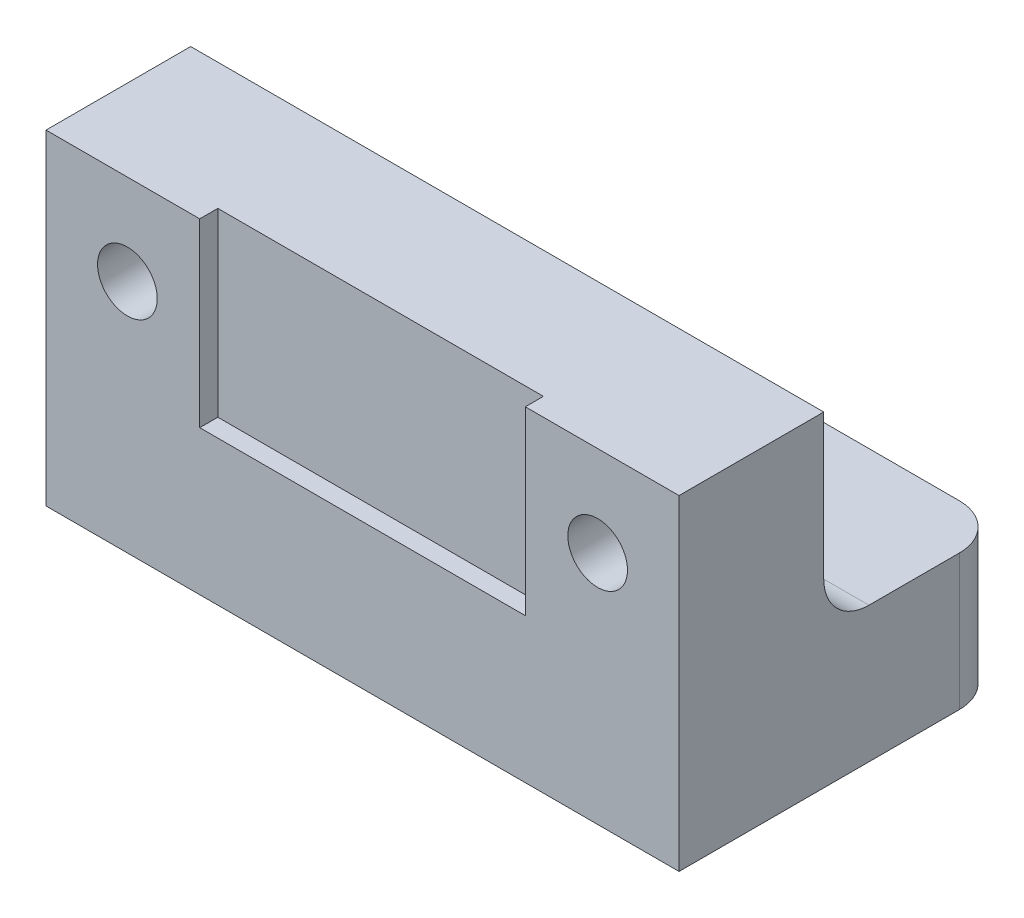
ISO-10303-21;
HEADER;
FILE_DESCRIPTION(('STEP AP214'),'2;1');
FILE_NAME('part.step','',(''),(''),'','','');
FILE_SCHEMA(('AUTOMOTIVE_DESIGN { 1 0 10303 214 1 1 1 1 }'));
ENDSEC;
DATA;
#1=APPLICATION_CONTEXT('core data for automotive mechanical design processes');
#2=APPLICATION_PROTOCOL_DEFINITION('international standard','automotive_design',2000,#1);
#3=PRODUCT_CONTEXT('',#1,'mechanical');
#4=PRODUCT('Part','Part','',(#3));
#5=PRODUCT_RELATED_PRODUCT_CATEGORY('part','',(#4));
#6=PRODUCT_DEFINITION_FORMATION('','',#4);
#7=PRODUCT_DEFINITION_CONTEXT('part definition',#1,'design');
#8=PRODUCT_DEFINITION('design','',#6,#7);
#9=PRODUCT_DEFINITION_SHAPE('','',#8);
#10=(LENGTH_UNIT() NAMED_UNIT(*) SI_UNIT(.MILLI.,.METRE.));
#11=(NAMED_UNIT(*) PLANE_ANGLE_UNIT() SI_UNIT($,.RADIAN.));
#12=(NAMED_UNIT(*) SI_UNIT($,.STERADIAN.) SOLID_ANGLE_UNIT());
#13=UNCERTAINTY_MEASURE_WITH_UNIT(LENGTH_MEASURE(1.E-05),#10,'distance_accuracy_value','');
#14=(GEOMETRIC_REPRESENTATION_CONTEXT(3) GLOBAL_UNCERTAINTY_ASSIGNED_CONTEXT((#13)) GLOBAL_UNIT_ASSIGNED_CONTEXT((#10,
#11,#12)) REPRESENTATION_CONTEXT('',''));
#15=CARTESIAN_POINT('',(0.,0.,0.));
#16=DIRECTION('',(0.,0.,1.));
#17=DIRECTION('',(1.,0.,0.));
#18=AXIS2_PLACEMENT_3D('',#15,#16,#17);
#19=CARTESIAN_POINT('',(0.,0.,0.));
#20=DIRECTION('',(0.,0.,-1.));
#21=DIRECTION('',(-1.,0.,0.));
#22=AXIS2_PLACEMENT_3D('',#19,#20,#21);
#23=PLANE('',#22);
#24=DIRECTION('',(0.,1.,0.));
#25=VECTOR('',#24,1.);
#26=CARTESIAN_POINT('',(17.5,-9.,0.));
#27=LINE('',#26,#25);
#28=CARTESIAN_POINT('',(17.5,0.999999999999997,0.));
#29=VERTEX_POINT('',#28);
#30=CARTESIAN_POINT('',(17.5,9.,0.));
#31=VERTEX_POINT('',#30);
#32=EDGE_CURVE('E179',#29,#31,#27,.T.);
#33=ORIENTED_EDGE('',*,*,#32,.F.);
#34=DIRECTION('',(-1.,0.,0.));
#35=VECTOR('',#34,1.);
#36=CARTESIAN_POINT('',(-17.5,0.999999999999994,0.));
#37=LINE('',#36,#35);
#38=CARTESIAN_POINT('',(13.,0.999999999999997,0.));
#39=VERTEX_POINT('',#38);
#40=EDGE_CURVE('E223',#29,#39,#37,.T.);
#41=ORIENTED_EDGE('',*,*,#40,.T.);
#42=CARTESIAN_POINT('',(13.,4.,0.));
#43=DIRECTION('',(0.,0.,-1.));
#44=DIRECTION('',(-1.,0.,0.));
#45=AXIS2_PLACEMENT_3D('',#42,#43,#44);
#46=CIRCLE('',#45,3.);
#47=EDGE_CURVE('E369',#39,#39,#46,.T.);
#48=ORIENTED_EDGE('',*,*,#47,.F.);
#49=DIRECTION('',(-1.,0.,0.));
#50=VECTOR('',#49,1.);
#51=CARTESIAN_POINT('',(-17.5,0.999999999999994,0.));
#52=LINE('',#51,#50);
#53=CARTESIAN_POINT('',(-13.,0.999999999999994,0.));
#54=VERTEX_POINT('',#53);
#55=EDGE_CURVE('E221',#39,#54,#52,.T.);
#56=ORIENTED_EDGE('',*,*,#55,.T.);
#57=CARTESIAN_POINT('',(-13.,4.,0.));
#58=DIRECTION('',(0.,0.,-1.));
#59=DIRECTION('',(-1.,0.,0.));
#60=AXIS2_PLACEMENT_3D('',#57,#58,#59);
#61=CIRCLE('',#60,3.);
#62=EDGE_CURVE('E371',#54,#54,#61,.T.);
#63=ORIENTED_EDGE('',*,*,#62,.F.);
#64=DIRECTION('',(-1.,0.,0.));
#65=VECTOR('',#64,1.);
#66=CARTESIAN_POINT('',(-17.5,0.999999999999994,0.));
#67=LINE('',#66,#65);
#68=CARTESIAN_POINT('',(-17.5,0.999999999999994,0.));
#69=VERTEX_POINT('',#68);
#70=EDGE_CURVE('E212',#54,#69,#67,.T.);
#71=ORIENTED_EDGE('',*,*,#70,.T.);
#72=DIRECTION('',(0.,-1.,0.));
#73=VECTOR('',#72,1.);
#74=CARTESIAN_POINT('',(-17.5,-9.,0.));
#75=LINE('',#74,#73);
#76=CARTESIAN_POINT('',(-17.5,9.,0.));
#77=VERTEX_POINT('',#76);
#78=EDGE_CURVE('E188',#77,#69,#75,.T.);
#79=ORIENTED_EDGE('',*,*,#78,.F.);
#80=DIRECTION('',(-1.,0.,0.));
#81=VECTOR('',#80,1.);
#82=CARTESIAN_POINT('',(-17.5,9.,0.));
#83=LINE('',#82,#81);
#84=EDGE_CURVE('E198',#31,#77,#83,.T.);
#85=ORIENTED_EDGE('',*,*,#84,.F.);
#86=EDGE_LOOP('',(#33,#41,#48,#56,#63,#71,#79,#85));
#87=FACE_BOUND('',#86,.T.);
#88=ADVANCED_FACE('F37',(#87),#23,.T.);
#89=CARTESIAN_POINT('',(-13.,4.,8.001));
#90=DIRECTION('',(0.,0.,-1.));
#91=DIRECTION('',(-1.,0.,0.));
#92=AXIS2_PLACEMENT_3D('',#89,#90,#91);
#93=CYLINDRICAL_SURFACE('',#92,1.65);
#94=CARTESIAN_POINT('',(-13.,4.,8.));
#95=DIRECTION('',(0.,0.,-1.));
#96=DIRECTION('',(-1.,0.,0.));
#97=AXIS2_PLACEMENT_3D('',#94,#95,#96);
#98=CIRCLE('',#97,1.65);
#99=CARTESIAN_POINT('',(-14.65,4.,8.));
#100=VERTEX_POINT('',#99);
#101=EDGE_CURVE('E169',#100,#100,#98,.F.);
#102=ORIENTED_EDGE('',*,*,#101,.T.);
#103=EDGE_LOOP('',(#102));
#104=FACE_BOUND('',#103,.T.);
#105=CARTESIAN_POINT('',(-13.,4.,4.));
#106=DIRECTION('',(0.,0.,-1.));
#107=DIRECTION('',(-1.,0.,0.));
#108=AXIS2_PLACEMENT_3D('',#105,#106,#107);
#109=CIRCLE('',#108,1.65);
#110=CARTESIAN_POINT('',(-14.65,4.,4.));
#111=VERTEX_POINT('',#110);
#112=EDGE_CURVE('E216',#111,#111,#109,.F.);
#113=ORIENTED_EDGE('',*,*,#112,.F.);
#114=EDGE_LOOP('',(#113));
#115=FACE_BOUND('',#114,.T.);
#116=ADVANCED_FACE('F300',(#104,#115),#93,.F.);
#117=CARTESIAN_POINT('',(13.,4.,8.001));
#118=DIRECTION('',(0.,0.,-1.));
#119=DIRECTION('',(-1.,0.,0.));
#120=AXIS2_PLACEMENT_3D('',#117,#118,#119);
#121=CYLINDRICAL_SURFACE('',#120,1.65);
#122=CARTESIAN_POINT('',(13.,4.,8.));
#123=DIRECTION('',(0.,0.,-1.));
#124=DIRECTION('',(-1.,0.,0.));
#125=AXIS2_PLACEMENT_3D('',#122,#123,#124);
#126=CIRCLE('',#125,1.65);
#127=CARTESIAN_POINT('',(11.35,4.,8.));
#128=VERTEX_POINT('',#127);
#129=EDGE_CURVE('E175',#128,#128,#126,.F.);
#130=ORIENTED_EDGE('',*,*,#129,.T.);
#131=EDGE_LOOP('',(#130));
#132=FACE_BOUND('',#131,.T.);
#133=CARTESIAN_POINT('',(13.,4.,4.));
#134=DIRECTION('',(0.,0.,-1.));
#135=DIRECTION('',(-1.,0.,0.));
#136=AXIS2_PLACEMENT_3D('',#133,#134,#135);
#137=CIRCLE('',#136,1.65);
#138=CARTESIAN_POINT('',(11.35,4.,4.));
#139=VERTEX_POINT('',#138);
#140=EDGE_CURVE('E213',#139,#139,#137,.F.);
#141=ORIENTED_EDGE('',*,*,#140,.F.);
#142=EDGE_LOOP('',(#141));
#143=FACE_BOUND('',#142,.T.);
#144=ADVANCED_FACE('F304',(#132,#143),#121,.F.);
#145=CARTESIAN_POINT('',(17.5,-9.,8.));
#146=DIRECTION('',(-1.,0.,0.));
#147=DIRECTION('',(0.,0.,1.));
#148=AXIS2_PLACEMENT_3D('',#145,#146,#147);
#149=PLANE('',#148);
#150=DIRECTION('',(0.,0.,-1.));
#151=VECTOR('',#150,1.);
#152=CARTESIAN_POINT('',(17.5,-9.,8.));
#153=LINE('',#152,#151);
#154=CARTESIAN_POINT('',(17.5,-9.,8.));
#155=VERTEX_POINT('',#154);
#156=CARTESIAN_POINT('',(17.5,-9.,-7.5));
#157=VERTEX_POINT('',#156);
#158=EDGE_CURVE('E196',#155,#157,#153,.T.);
#159=ORIENTED_EDGE('',*,*,#158,.T.);
#160=DIRECTION('',(0.,1.,0.));
#161=VECTOR('',#160,1.);
#162=CARTESIAN_POINT('',(17.5,-9.,-7.5));
#163=LINE('',#162,#161);
#164=CARTESIAN_POINT('',(17.5,-1.5,-7.5));
#165=VERTEX_POINT('',#164);
#166=EDGE_CURVE('E241',#157,#165,#163,.T.);
#167=ORIENTED_EDGE('',*,*,#166,.T.);
#168=DIRECTION('',(0.,0.,1.));
#169=VECTOR('',#168,1.);
#170=CARTESIAN_POINT('',(17.5,-1.5,-10.));
#171=LINE('',#170,#169);
#172=CARTESIAN_POINT('',(17.5,-1.5,-2.5));
#173=VERTEX_POINT('',#172);
#174=EDGE_CURVE('E261',#165,#173,#171,.T.);
#175=ORIENTED_EDGE('',*,*,#174,.T.);
#176=CARTESIAN_POINT('',(17.5,0.999999999999997,-2.5));
#177=DIRECTION('',(-1.,0.,0.));
#178=DIRECTION('',(0.,0.,1.));
#179=AXIS2_PLACEMENT_3D('',#176,#177,#178);
#180=CIRCLE('',#179,2.5);
#181=EDGE_CURVE('E11',#173,#29,#180,.T.);
#182=ORIENTED_EDGE('',*,*,#181,.T.);
#183=ORIENTED_EDGE('',*,*,#32,.T.);
#184=DIRECTION('',(0.,0.,-1.));
#185=VECTOR('',#184,1.);
#186=CARTESIAN_POINT('',(17.5,9.,8.));
#187=LINE('',#186,#185);
#188=CARTESIAN_POINT('',(17.5,9.,8.));
#189=VERTEX_POINT('',#188);
#190=EDGE_CURVE('E209',#189,#31,#187,.T.);
#191=ORIENTED_EDGE('',*,*,#190,.F.);
#192=DIRECTION('',(0.,1.,0.));
#193=VECTOR('',#192,1.);
#194=CARTESIAN_POINT('',(17.5,-9.,8.));
#195=LINE('',#194,#193);
#196=EDGE_CURVE('E184',#155,#189,#195,.T.);
#197=ORIENTED_EDGE('',*,*,#196,.F.);
#198=EDGE_LOOP('',(#159,#167,#175,#182,#183,#191,#197));
#199=FACE_BOUND('',#198,.T.);
#200=ADVANCED_FACE('F268',(#199),#149,.F.);
#201=CARTESIAN_POINT('',(-17.5,9.,8.));
#202=DIRECTION('',(0.,-1.,0.));
#203=DIRECTION('',(0.,0.,-1.));
#204=AXIS2_PLACEMENT_3D('',#201,#202,#203);
#205=PLANE('',#204);
#206=DIRECTION('',(-1.,0.,0.));
#207=VECTOR('',#206,1.);
#208=CARTESIAN_POINT('',(-17.5,9.,8.));
#209=LINE('',#208,#207);
#210=CARTESIAN_POINT('',(-9.,9.,8.));
#211=VERTEX_POINT('',#210);
#212=CARTESIAN_POINT('',(-17.5,9.,8.));
#213=VERTEX_POINT('',#212);
#214=EDGE_CURVE('E187',#211,#213,#209,.T.);
#215=ORIENTED_EDGE('',*,*,#214,.F.);
#216=DIRECTION('',(0.,0.,1.));
#217=VECTOR('',#216,1.);
#218=CARTESIAN_POINT('',(-9.,9.,7.));
#219=LINE('',#218,#217);
#220=CARTESIAN_POINT('',(-9.,9.,7.));
#221=VERTEX_POINT('',#220);
#222=EDGE_CURVE('E177',#221,#211,#219,.T.);
#223=ORIENTED_EDGE('',*,*,#222,.F.);
#224=DIRECTION('',(-1.,0.,0.));
#225=VECTOR('',#224,1.);
#226=CARTESIAN_POINT('',(-9.,9.,7.));
#227=LINE('',#226,#225);
#228=CARTESIAN_POINT('',(9.,9.,7.));
#229=VERTEX_POINT('',#228);
#230=EDGE_CURVE('E151',#229,#221,#227,.T.);
#231=ORIENTED_EDGE('',*,*,#230,.F.);
#232=DIRECTION('',(0.,0.,1.));
#233=VECTOR('',#232,1.);
#234=CARTESIAN_POINT('',(9.,9.,7.));
#235=LINE('',#234,#233);
#236=CARTESIAN_POINT('',(9.,9.,8.));
#237=VERTEX_POINT('',#236);
#238=EDGE_CURVE('E180',#229,#237,#235,.T.);
#239=ORIENTED_EDGE('',*,*,#238,.T.);
#240=EDGE_CURVE('E189',#189,#237,#209,.T.);
#241=ORIENTED_EDGE('',*,*,#240,.F.);
#242=ORIENTED_EDGE('',*,*,#190,.T.);
#243=ORIENTED_EDGE('',*,*,#84,.T.);
#244=DIRECTION('',(0.,0.,-1.));
#245=VECTOR('',#244,1.);
#246=CARTESIAN_POINT('',(-17.5,9.,8.));
#247=LINE('',#246,#245);
#248=EDGE_CURVE('E206',#213,#77,#247,.T.);
#249=ORIENTED_EDGE('',*,*,#248,.F.);
#250=EDGE_LOOP('',(#215,#223,#231,#239,#241,#242,#243,#249));
#251=FACE_BOUND('',#250,.T.);
#252=ADVANCED_FACE('F277',(#251),#205,.F.);
#253=CARTESIAN_POINT('',(-17.5,-9.,8.));
#254=DIRECTION('',(1.,0.,0.));
#255=DIRECTION('',(0.,0.,-1.));
#256=AXIS2_PLACEMENT_3D('',#253,#254,#255);
#257=PLANE('',#256);
#258=DIRECTION('',(0.,0.,1.));
#259=VECTOR('',#258,1.);
#260=CARTESIAN_POINT('',(-17.5,-1.50000000000001,-10.));
#261=LINE('',#260,#259);
#262=CARTESIAN_POINT('',(-17.5,-1.50000000000001,-7.5));
#263=VERTEX_POINT('',#262);
#264=CARTESIAN_POINT('',(-17.5,-1.50000000000001,-2.5));
#265=VERTEX_POINT('',#264);
#266=EDGE_CURVE('E248',#263,#265,#261,.T.);
#267=ORIENTED_EDGE('',*,*,#266,.F.);
#268=DIRECTION('',(0.,-1.,0.));
#269=VECTOR('',#268,1.);
#270=CARTESIAN_POINT('',(-17.5,-9.,-7.5));
#271=LINE('',#270,#269);
#272=CARTESIAN_POINT('',(-17.5,-9.,-7.5));
#273=VERTEX_POINT('',#272);
#274=EDGE_CURVE('E232',#263,#273,#271,.T.);
#275=ORIENTED_EDGE('',*,*,#274,.T.);
#276=DIRECTION('',(0.,0.,-1.));
#277=VECTOR('',#276,1.);
#278=CARTESIAN_POINT('',(-17.5,-9.,8.));
#279=LINE('',#278,#277);
#280=CARTESIAN_POINT('',(-17.5,-9.,8.));
#281=VERTEX_POINT('',#280);
#282=EDGE_CURVE('E203',#281,#273,#279,.T.);
#283=ORIENTED_EDGE('',*,*,#282,.F.);
#284=DIRECTION('',(0.,-1.,0.));
#285=VECTOR('',#284,1.);
#286=CARTESIAN_POINT('',(-17.5,-9.,8.));
#287=LINE('',#286,#285);
#288=EDGE_CURVE('E192',#213,#281,#287,.T.);
#289=ORIENTED_EDGE('',*,*,#288,.F.);
#290=ORIENTED_EDGE('',*,*,#248,.T.);
#291=ORIENTED_EDGE('',*,*,#78,.T.);
#292=CARTESIAN_POINT('',(-17.5,0.999999999999994,-2.5));
#293=DIRECTION('',(1.,0.,0.));
#294=DIRECTION('',(0.,0.,-1.));
#295=AXIS2_PLACEMENT_3D('',#292,#293,#294);
#296=CIRCLE('',#295,2.5);
#297=EDGE_CURVE('E45',#69,#265,#296,.T.);
#298=ORIENTED_EDGE('',*,*,#297,.T.);
#299=EDGE_LOOP('',(#267,#275,#283,#289,#290,#291,#298));
#300=FACE_BOUND('',#299,.T.);
#301=ADVANCED_FACE('F247',(#300),#257,.F.);
#302=CARTESIAN_POINT('',(-17.5,-9.,8.));
#303=DIRECTION('',(0.,1.,0.));
#304=DIRECTION('',(0.,0.,1.));
#305=AXIS2_PLACEMENT_3D('',#302,#303,#304);
#306=PLANE('',#305);
#307=CARTESIAN_POINT('',(0.,-9.,-1.));
#308=DIRECTION('',(0.,-1.,0.));
#309=DIRECTION('',(0.,0.,-1.));
#310=AXIS2_PLACEMENT_3D('',#307,#308,#309);
#311=CIRCLE('',#310,8.);
#312=CARTESIAN_POINT('',(0.,-9.,-9.));
#313=VERTEX_POINT('',#312);
#314=EDGE_CURVE('E358',#313,#313,#311,.T.);
#315=ORIENTED_EDGE('',*,*,#314,.F.);
#316=EDGE_LOOP('',(#315));
#317=FACE_BOUND('',#316,.T.);
#318=ORIENTED_EDGE('',*,*,#282,.T.);
#319=CARTESIAN_POINT('',(-15.,-9.,-7.5));
#320=DIRECTION('',(0.,1.,0.));
#321=DIRECTION('',(0.,0.,1.));
#322=AXIS2_PLACEMENT_3D('',#319,#320,#321);
#323=CIRCLE('',#322,2.5);
#324=CARTESIAN_POINT('',(-15.,-9.00000000000001,-10.));
#325=VERTEX_POINT('',#324);
#326=EDGE_CURVE('E236',#273,#325,#323,.F.);
#327=ORIENTED_EDGE('',*,*,#326,.T.);
#328=DIRECTION('',(1.,0.,0.));
#329=VECTOR('',#328,1.);
#330=CARTESIAN_POINT('',(17.5,-9.,-10.));
#331=LINE('',#330,#329);
#332=CARTESIAN_POINT('',(15.,-9.,-10.));
#333=VERTEX_POINT('',#332);
#334=EDGE_CURVE('E360',#325,#333,#331,.T.);
#335=ORIENTED_EDGE('',*,*,#334,.T.);
#336=CARTESIAN_POINT('',(15.,-9.,-7.5));
#337=DIRECTION('',(0.,1.,0.));
#338=DIRECTION('',(0.,0.,1.));
#339=AXIS2_PLACEMENT_3D('',#336,#337,#338);
#340=CIRCLE('',#339,2.5);
#341=EDGE_CURVE('E52',#333,#157,#340,.F.);
#342=ORIENTED_EDGE('',*,*,#341,.T.);
#343=ORIENTED_EDGE('',*,*,#158,.F.);
#344=DIRECTION('',(1.,0.,0.));
#345=VECTOR('',#344,1.);
#346=CARTESIAN_POINT('',(-17.5,-9.,8.));
#347=LINE('',#346,#345);
#348=EDGE_CURVE('E194',#281,#155,#347,.T.);
#349=ORIENTED_EDGE('',*,*,#348,.F.);
#350=EDGE_LOOP('',(#318,#327,#335,#342,#343,#349));
#351=FACE_BOUND('',#350,.T.);
#352=ADVANCED_FACE('F286',(#317,#351),#306,.F.);
#353=CARTESIAN_POINT('',(0.,0.,8.));
#354=DIRECTION('',(0.,0.,-1.));
#355=DIRECTION('',(-1.,0.,0.));
#356=AXIS2_PLACEMENT_3D('',#353,#354,#355);
#357=PLANE('',#356);
#358=ORIENTED_EDGE('',*,*,#129,.F.);
#359=EDGE_LOOP('',(#358));
#360=FACE_BOUND('',#359,.T.);
#361=ORIENTED_EDGE('',*,*,#101,.F.);
#362=EDGE_LOOP('',(#361));
#363=FACE_BOUND('',#362,.T.);
#364=DIRECTION('',(1.,0.,0.));
#365=VECTOR('',#364,1.);
#366=CARTESIAN_POINT('',(-9.,-1.,8.));
#367=LINE('',#366,#365);
#368=CARTESIAN_POINT('',(-9.,-1.,8.));
#369=VERTEX_POINT('',#368);
#370=CARTESIAN_POINT('',(9.,-1.,8.));
#371=VERTEX_POINT('',#370);
#372=EDGE_CURVE('E166',#369,#371,#367,.T.);
#373=ORIENTED_EDGE('',*,*,#372,.F.);
#374=DIRECTION('',(0.,-1.,0.));
#375=VECTOR('',#374,1.);
#376=CARTESIAN_POINT('',(-9.,9.,8.));
#377=LINE('',#376,#375);
#378=EDGE_CURVE('E146',#211,#369,#377,.T.);
#379=ORIENTED_EDGE('',*,*,#378,.F.);
#380=ORIENTED_EDGE('',*,*,#214,.T.);
#381=ORIENTED_EDGE('',*,*,#288,.T.);
#382=ORIENTED_EDGE('',*,*,#348,.T.);
#383=ORIENTED_EDGE('',*,*,#196,.T.);
#384=ORIENTED_EDGE('',*,*,#240,.T.);
#385=DIRECTION('',(0.,1.,0.));
#386=VECTOR('',#385,1.);
#387=CARTESIAN_POINT('',(9.,9.,8.));
#388=LINE('',#387,#386);
#389=EDGE_CURVE('E164',#371,#237,#388,.T.);
#390=ORIENTED_EDGE('',*,*,#389,.F.);
#391=EDGE_LOOP('',(#373,#379,#380,#381,#382,#383,#384,#390));
#392=FACE_BOUND('',#391,.T.);
#393=ADVANCED_FACE('F281',(#360,#363,#392),#357,.F.);
#394=CARTESIAN_POINT('',(-9.,9.,7.));
#395=DIRECTION('',(-1.,0.,0.));
#396=DIRECTION('',(0.,-1.,0.));
#397=AXIS2_PLACEMENT_3D('',#394,#395,#396);
#398=PLANE('',#397);
#399=ORIENTED_EDGE('',*,*,#378,.T.);
#400=DIRECTION('',(0.,0.,1.));
#401=VECTOR('',#400,1.);
#402=CARTESIAN_POINT('',(-9.,-1.,7.));
#403=LINE('',#402,#401);
#404=CARTESIAN_POINT('',(-9.,-1.,7.));
#405=VERTEX_POINT('',#404);
#406=EDGE_CURVE('E139',#405,#369,#403,.T.);
#407=ORIENTED_EDGE('',*,*,#406,.F.);
#408=DIRECTION('',(0.,-1.,0.));
#409=VECTOR('',#408,1.);
#410=CARTESIAN_POINT('',(-9.,9.,7.));
#411=LINE('',#410,#409);
#412=EDGE_CURVE('E143',#221,#405,#411,.T.);
#413=ORIENTED_EDGE('',*,*,#412,.F.);
#414=ORIENTED_EDGE('',*,*,#222,.T.);
#415=EDGE_LOOP('',(#399,#407,#413,#414));
#416=FACE_BOUND('',#415,.T.);
#417=ADVANCED_FACE('F141',(#416),#398,.F.);
#418=CARTESIAN_POINT('',(9.,9.,7.));
#419=DIRECTION('',(1.,0.,0.));
#420=DIRECTION('',(0.,1.,0.));
#421=AXIS2_PLACEMENT_3D('',#418,#419,#420);
#422=PLANE('',#421);
#423=ORIENTED_EDGE('',*,*,#389,.T.);
#424=ORIENTED_EDGE('',*,*,#238,.F.);
#425=DIRECTION('',(0.,1.,0.));
#426=VECTOR('',#425,1.);
#427=CARTESIAN_POINT('',(9.,9.,7.));
#428=LINE('',#427,#426);
#429=CARTESIAN_POINT('',(9.,-1.,7.));
#430=VERTEX_POINT('',#429);
#431=EDGE_CURVE('E159',#430,#229,#428,.T.);
#432=ORIENTED_EDGE('',*,*,#431,.F.);
#433=DIRECTION('',(0.,0.,1.));
#434=VECTOR('',#433,1.);
#435=CARTESIAN_POINT('',(9.,-1.,7.));
#436=LINE('',#435,#434);
#437=EDGE_CURVE('E150',#430,#371,#436,.T.);
#438=ORIENTED_EDGE('',*,*,#437,.T.);
#439=EDGE_LOOP('',(#423,#424,#432,#438));
#440=FACE_BOUND('',#439,.T.);
#441=ADVANCED_FACE('F310',(#440),#422,.F.);
#442=CARTESIAN_POINT('',(-9.,-1.,7.));
#443=DIRECTION('',(0.,-1.,0.));
#444=DIRECTION('',(1.,0.,0.));
#445=AXIS2_PLACEMENT_3D('',#442,#443,#444);
#446=PLANE('',#445);
#447=ORIENTED_EDGE('',*,*,#372,.T.);
#448=ORIENTED_EDGE('',*,*,#437,.F.);
#449=DIRECTION('',(1.,0.,0.));
#450=VECTOR('',#449,1.);
#451=CARTESIAN_POINT('',(-9.,-1.,7.));
#452=LINE('',#451,#450);
#453=EDGE_CURVE('E154',#405,#430,#452,.T.);
#454=ORIENTED_EDGE('',*,*,#453,.F.);
#455=ORIENTED_EDGE('',*,*,#406,.T.);
#456=EDGE_LOOP('',(#447,#448,#454,#455));
#457=FACE_BOUND('',#456,.T.);
#458=ADVANCED_FACE('F155',(#457),#446,.F.);
#459=CARTESIAN_POINT('',(0.,0.,7.));
#460=DIRECTION('',(0.,0.,1.));
#461=DIRECTION('',(1.,0.,0.));
#462=AXIS2_PLACEMENT_3D('',#459,#460,#461);
#463=PLANE('',#462);
#464=ORIENTED_EDGE('',*,*,#412,.T.);
#465=ORIENTED_EDGE('',*,*,#453,.T.);
#466=ORIENTED_EDGE('',*,*,#431,.T.);
#467=ORIENTED_EDGE('',*,*,#230,.T.);
#468=EDGE_LOOP('',(#464,#465,#466,#467));
#469=FACE_BOUND('',#468,.T.);
#470=ADVANCED_FACE('F161',(#469),#463,.T.);
#471=CARTESIAN_POINT('',(13.,4.,4.));
#472=DIRECTION('',(0.,0.,-1.));
#473=DIRECTION('',(-1.,0.,0.));
#474=AXIS2_PLACEMENT_3D('',#471,#472,#473);
#475=PLANE('',#474);
#476=CARTESIAN_POINT('',(13.,4.,4.));
#477=DIRECTION('',(0.,0.,-1.));
#478=DIRECTION('',(-1.,0.,0.));
#479=AXIS2_PLACEMENT_3D('',#476,#477,#478);
#480=CIRCLE('',#479,3.);
#481=CARTESIAN_POINT('',(10.,4.,4.));
#482=VERTEX_POINT('',#481);
#483=EDGE_CURVE('E217',#482,#482,#480,.T.);
#484=ORIENTED_EDGE('',*,*,#483,.T.);
#485=EDGE_LOOP('',(#484));
#486=FACE_BOUND('',#485,.T.);
#487=ORIENTED_EDGE('',*,*,#140,.T.);
#488=EDGE_LOOP('',(#487));
#489=FACE_BOUND('',#488,.T.);
#490=ADVANCED_FACE('F317',(#486,#489),#475,.T.);
#491=CARTESIAN_POINT('',(13.,4.,4.));
#492=DIRECTION('',(0.,0.,-1.));
#493=DIRECTION('',(-1.,0.,0.));
#494=AXIS2_PLACEMENT_3D('',#491,#492,#493);
#495=CYLINDRICAL_SURFACE('',#494,3.);
#496=ORIENTED_EDGE('',*,*,#483,.F.);
#497=EDGE_LOOP('',(#496));
#498=FACE_BOUND('',#497,.T.);
#499=ORIENTED_EDGE('',*,*,#47,.T.);
#500=EDGE_LOOP('',(#499));
#501=FACE_BOUND('',#500,.T.);
#502=ADVANCED_FACE('F326',(#498,#501),#495,.F.);
#503=CARTESIAN_POINT('',(-13.,4.,4.));
#504=DIRECTION('',(0.,0.,-1.));
#505=DIRECTION('',(-1.,0.,0.));
#506=AXIS2_PLACEMENT_3D('',#503,#504,#505);
#507=PLANE('',#506);
#508=CARTESIAN_POINT('',(-13.,4.,4.));
#509=DIRECTION('',(0.,0.,-1.));
#510=DIRECTION('',(-1.,0.,0.));
#511=AXIS2_PLACEMENT_3D('',#508,#509,#510);
#512=CIRCLE('',#511,3.);
#513=CARTESIAN_POINT('',(-16.,4.,4.));
#514=VERTEX_POINT('',#513);
#515=EDGE_CURVE('E260',#514,#514,#512,.T.);
#516=ORIENTED_EDGE('',*,*,#515,.T.);
#517=EDGE_LOOP('',(#516));
#518=FACE_BOUND('',#517,.T.);
#519=ORIENTED_EDGE('',*,*,#112,.T.);
#520=EDGE_LOOP('',(#519));
#521=FACE_BOUND('',#520,.T.);
#522=ADVANCED_FACE('F322',(#518,#521),#507,.T.);
#523=CARTESIAN_POINT('',(-13.,4.,4.));
#524=DIRECTION('',(0.,0.,-1.));
#525=DIRECTION('',(-1.,0.,0.));
#526=AXIS2_PLACEMENT_3D('',#523,#524,#525);
#527=CYLINDRICAL_SURFACE('',#526,3.);
#528=ORIENTED_EDGE('',*,*,#515,.F.);
#529=EDGE_LOOP('',(#528));
#530=FACE_BOUND('',#529,.T.);
#531=ORIENTED_EDGE('',*,*,#62,.T.);
#532=EDGE_LOOP('',(#531));
#533=FACE_BOUND('',#532,.T.);
#534=ADVANCED_FACE('F325',(#530,#533),#527,.F.);
#535=CARTESIAN_POINT('',(17.5,-1.5,-10.));
#536=DIRECTION('',(0.,1.,0.));
#537=DIRECTION('',(-1.,0.,0.));
#538=AXIS2_PLACEMENT_3D('',#535,#536,#537);
#539=PLANE('',#538);
#540=ORIENTED_EDGE('',*,*,#266,.T.);
#541=DIRECTION('',(-1.,0.,0.));
#542=VECTOR('',#541,1.);
#543=CARTESIAN_POINT('',(17.5,-1.5,-2.5));
#544=LINE('',#543,#542);
#545=EDGE_CURVE('E230',#265,#173,#544,.F.);
#546=ORIENTED_EDGE('',*,*,#545,.T.);
#547=ORIENTED_EDGE('',*,*,#174,.F.);
#548=CARTESIAN_POINT('',(15.,-1.5,-7.5));
#549=DIRECTION('',(0.,1.,0.));
#550=DIRECTION('',(-1.,0.,0.));
#551=AXIS2_PLACEMENT_3D('',#548,#549,#550);
#552=CIRCLE('',#551,2.5);
#553=CARTESIAN_POINT('',(15.,-1.5,-10.));
#554=VERTEX_POINT('',#553);
#555=EDGE_CURVE('E226',#165,#554,#552,.T.);
#556=ORIENTED_EDGE('',*,*,#555,.T.);
#557=DIRECTION('',(-1.,0.,0.));
#558=VECTOR('',#557,1.);
#559=CARTESIAN_POINT('',(17.5,-1.5,-10.));
#560=LINE('',#559,#558);
#561=CARTESIAN_POINT('',(-15.,-1.50000000000001,-10.));
#562=VERTEX_POINT('',#561);
#563=EDGE_CURVE('E357',#554,#562,#560,.T.);
#564=ORIENTED_EDGE('',*,*,#563,.T.);
#565=CARTESIAN_POINT('',(-15.,-1.50000000000001,-7.5));
#566=DIRECTION('',(0.,1.,0.));
#567=DIRECTION('',(-1.,0.,0.));
#568=AXIS2_PLACEMENT_3D('',#565,#566,#567);
#569=CIRCLE('',#568,2.5);
#570=EDGE_CURVE('E228',#562,#263,#569,.T.);
#571=ORIENTED_EDGE('',*,*,#570,.T.);
#572=EDGE_LOOP('',(#540,#546,#547,#556,#564,#571));
#573=FACE_BOUND('',#572,.T.);
#574=ADVANCED_FACE('F255',(#573),#539,.T.);
#575=CARTESIAN_POINT('',(0.,0.,-10.));
#576=DIRECTION('',(0.,0.,1.));
#577=DIRECTION('',(1.,0.,0.));
#578=AXIS2_PLACEMENT_3D('',#575,#576,#577);
#579=PLANE('',#578);
#580=ORIENTED_EDGE('',*,*,#334,.F.);
#581=DIRECTION('',(0.,-1.,0.));
#582=VECTOR('',#581,1.);
#583=CARTESIAN_POINT('',(-15.,0.,-10.));
#584=LINE('',#583,#582);
#585=EDGE_CURVE('E239',#325,#562,#584,.F.);
#586=ORIENTED_EDGE('',*,*,#585,.T.);
#587=ORIENTED_EDGE('',*,*,#563,.F.);
#588=DIRECTION('',(0.,1.,0.));
#589=VECTOR('',#588,1.);
#590=CARTESIAN_POINT('',(15.,0.,-10.));
#591=LINE('',#590,#589);
#592=EDGE_CURVE('E60',#554,#333,#591,.F.);
#593=ORIENTED_EDGE('',*,*,#592,.T.);
#594=EDGE_LOOP('',(#580,#586,#587,#593));
#595=FACE_BOUND('',#594,.T.);
#596=ADVANCED_FACE('F339',(#595),#579,.F.);
#597=CARTESIAN_POINT('',(0.,-4.2,-1.));
#598=DIRECTION('',(0.,-1.,0.));
#599=DIRECTION('',(0.,0.,-1.));
#600=AXIS2_PLACEMENT_3D('',#597,#598,#599);
#601=CYLINDRICAL_SURFACE('',#600,8.);
#602=CARTESIAN_POINT('',(0.,-4.2,-1.));
#603=DIRECTION('',(0.,-1.,0.));
#604=DIRECTION('',(0.,0.,-1.));
#605=AXIS2_PLACEMENT_3D('',#602,#603,#604);
#606=CIRCLE('',#605,8.);
#607=CARTESIAN_POINT('',(0.,-4.2,-9.));
#608=VERTEX_POINT('',#607);
#609=EDGE_CURVE('E356',#608,#608,#606,.T.);
#610=ORIENTED_EDGE('',*,*,#609,.F.);
#611=EDGE_LOOP('',(#610));
#612=FACE_BOUND('',#611,.T.);
#613=ORIENTED_EDGE('',*,*,#314,.T.);
#614=EDGE_LOOP('',(#613));
#615=FACE_BOUND('',#614,.T.);
#616=ADVANCED_FACE('F342',(#612,#615),#601,.F.);
#617=CARTESIAN_POINT('',(0.,-4.2,-1.));
#618=DIRECTION('',(0.,-1.,0.));
#619=DIRECTION('',(0.,0.,-1.));
#620=AXIS2_PLACEMENT_3D('',#617,#618,#619);
#621=PLANE('',#620);
#622=ORIENTED_EDGE('',*,*,#609,.T.);
#623=EDGE_LOOP('',(#622));
#624=FACE_BOUND('',#623,.T.);
#625=ADVANCED_FACE('F345',(#624),#621,.T.);
#626=CARTESIAN_POINT('',(0.,0.999999999999995,-2.5));
#627=DIRECTION('',(1.,0.,0.));
#628=DIRECTION('',(0.,1.,0.));
#629=AXIS2_PLACEMENT_3D('',#626,#627,#628);
#630=CYLINDRICAL_SURFACE('',#629,2.5);
#631=ORIENTED_EDGE('',*,*,#181,.F.);
#632=ORIENTED_EDGE('',*,*,#545,.F.);
#633=ORIENTED_EDGE('',*,*,#297,.F.);
#634=ORIENTED_EDGE('',*,*,#70,.F.);
#635=ORIENTED_EDGE('',*,*,#55,.F.);
#636=ORIENTED_EDGE('',*,*,#40,.F.);
#637=EDGE_LOOP('',(#631,#632,#633,#634,#635,#636));
#638=FACE_BOUND('',#637,.T.);
#639=ADVANCED_FACE('F264',(#638),#630,.F.);
#640=CARTESIAN_POINT('',(-15.,-9.,-7.5));
#641=DIRECTION('',(0.,-1.,0.));
#642=DIRECTION('',(0.,0.,-1.));
#643=AXIS2_PLACEMENT_3D('',#640,#641,#642);
#644=CYLINDRICAL_SURFACE('',#643,2.5);
#645=ORIENTED_EDGE('',*,*,#570,.F.);
#646=ORIENTED_EDGE('',*,*,#585,.F.);
#647=ORIENTED_EDGE('',*,*,#326,.F.);
#648=ORIENTED_EDGE('',*,*,#274,.F.);
#649=EDGE_LOOP('',(#645,#646,#647,#648));
#650=FACE_BOUND('',#649,.T.);
#651=ADVANCED_FACE('F352',(#650),#644,.T.);
#652=CARTESIAN_POINT('',(15.,-9.,-7.5));
#653=DIRECTION('',(0.,1.,0.));
#654=DIRECTION('',(0.,0.,1.));
#655=AXIS2_PLACEMENT_3D('',#652,#653,#654);
#656=CYLINDRICAL_SURFACE('',#655,2.5);
#657=ORIENTED_EDGE('',*,*,#341,.F.);
#658=ORIENTED_EDGE('',*,*,#592,.F.);
#659=ORIENTED_EDGE('',*,*,#555,.F.);
#660=ORIENTED_EDGE('',*,*,#166,.F.);
#661=EDGE_LOOP('',(#657,#658,#659,#660));
#662=FACE_BOUND('',#661,.T.);
#663=ADVANCED_FACE('F39',(#662),#656,.T.);
#664=CLOSED_SHELL('',(#88,#116,#144,#200,#252,#301,#352,#393,#417,#441,#458,#470,#490,#502,#522,
#534,#574,#596,#616,#625,#639,#651,#663));
#665=MANIFOLD_SOLID_BREP('B2',#664);
#666=ADVANCED_BREP_SHAPE_REPRESENTATION('',(#18,#665),#14);
#667=SHAPE_DEFINITION_REPRESENTATION(#9,#666);
ENDSEC;
END-ISO-10303-21;
